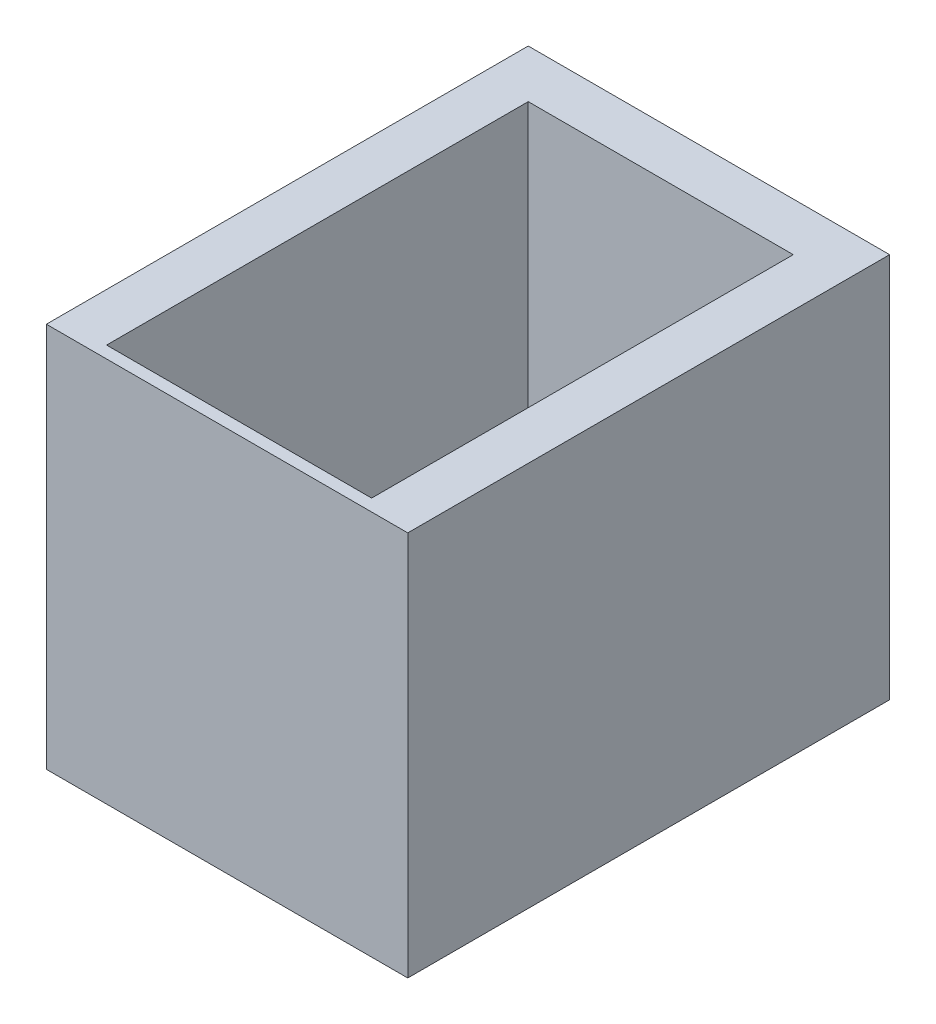
ISO-10303-21;
HEADER;
FILE_DESCRIPTION(('STEP AP214'),'2;1');
FILE_NAME('part.step','',(''),(''),'','','');
FILE_SCHEMA(('AUTOMOTIVE_DESIGN { 1 0 10303 214 1 1 1 1 }'));
ENDSEC;
DATA;
#1=APPLICATION_CONTEXT('core data for automotive mechanical design processes');
#2=APPLICATION_PROTOCOL_DEFINITION('international standard','automotive_design',2000,#1);
#3=PRODUCT_CONTEXT('',#1,'mechanical');
#4=PRODUCT('Part','Part','',(#3));
#5=PRODUCT_RELATED_PRODUCT_CATEGORY('part','',(#4));
#6=PRODUCT_DEFINITION_FORMATION('','',#4);
#7=PRODUCT_DEFINITION_CONTEXT('part definition',#1,'design');
#8=PRODUCT_DEFINITION('design','',#6,#7);
#9=PRODUCT_DEFINITION_SHAPE('','',#8);
#10=(LENGTH_UNIT() NAMED_UNIT(*) SI_UNIT(.MILLI.,.METRE.));
#11=(NAMED_UNIT(*) PLANE_ANGLE_UNIT() SI_UNIT($,.RADIAN.));
#12=(NAMED_UNIT(*) SI_UNIT($,.STERADIAN.) SOLID_ANGLE_UNIT());
#13=UNCERTAINTY_MEASURE_WITH_UNIT(LENGTH_MEASURE(1.E-05),#10,'distance_accuracy_value','');
#14=(GEOMETRIC_REPRESENTATION_CONTEXT(3) GLOBAL_UNCERTAINTY_ASSIGNED_CONTEXT((#13)) GLOBAL_UNIT_ASSIGNED_CONTEXT((#10,
#11,#12)) REPRESENTATION_CONTEXT('',''));
#15=CARTESIAN_POINT('',(0.,0.,0.));
#16=DIRECTION('',(0.,0.,1.));
#17=DIRECTION('',(1.,0.,0.));
#18=AXIS2_PLACEMENT_3D('',#15,#16,#17);
#19=CARTESIAN_POINT('',(0.,20.32,0.));
#20=DIRECTION('',(0.,-1.,0.));
#21=DIRECTION('',(0.,0.,-1.));
#22=AXIS2_PLACEMENT_3D('',#19,#20,#21);
#23=PLANE('',#22);
#24=DIRECTION('',(0.,0.,1.));
#25=VECTOR('',#24,1.);
#26=CARTESIAN_POINT('',(0.,20.32,0.));
#27=LINE('',#26,#25);
#28=CARTESIAN_POINT('',(0.,20.32,-25.4));
#29=VERTEX_POINT('',#28);
#30=CARTESIAN_POINT('',(0.,20.32,0.));
#31=VERTEX_POINT('',#30);
#32=EDGE_CURVE('E170',#29,#31,#27,.T.);
#33=ORIENTED_EDGE('',*,*,#32,.T.);
#34=DIRECTION('',(1.,0.,0.));
#35=VECTOR('',#34,1.);
#36=CARTESIAN_POINT('',(0.,20.32,0.));
#37=LINE('',#36,#35);
#38=CARTESIAN_POINT('',(19.05,20.32,0.));
#39=VERTEX_POINT('',#38);
#40=EDGE_CURVE('E174',#31,#39,#37,.T.);
#41=ORIENTED_EDGE('',*,*,#40,.T.);
#42=DIRECTION('',(0.,0.,-1.));
#43=VECTOR('',#42,1.);
#44=CARTESIAN_POINT('',(19.05,20.32,0.));
#45=LINE('',#44,#43);
#46=CARTESIAN_POINT('',(19.05,20.32,-25.4));
#47=VERTEX_POINT('',#46);
#48=EDGE_CURVE('E178',#39,#47,#45,.T.);
#49=ORIENTED_EDGE('',*,*,#48,.T.);
#50=DIRECTION('',(-1.,0.,0.));
#51=VECTOR('',#50,1.);
#52=CARTESIAN_POINT('',(0.,20.32,-25.4));
#53=LINE('',#52,#51);
#54=EDGE_CURVE('E181',#47,#29,#53,.T.);
#55=ORIENTED_EDGE('',*,*,#54,.T.);
#56=EDGE_LOOP('',(#33,#41,#49,#55));
#57=FACE_BOUND('',#56,.T.);
#58=DIRECTION('',(0.,0.,1.));
#59=VECTOR('',#58,1.);
#60=CARTESIAN_POINT('',(16.51,20.32,-22.86));
#61=LINE('',#60,#59);
#62=CARTESIAN_POINT('',(16.51,20.32,-22.86));
#63=VERTEX_POINT('',#62);
#64=CARTESIAN_POINT('',(16.51,20.32,-0.635));
#65=VERTEX_POINT('',#64);
#66=EDGE_CURVE('E111',#63,#65,#61,.T.);
#67=ORIENTED_EDGE('',*,*,#66,.T.);
#68=DIRECTION('',(-1.,0.,0.));
#69=VECTOR('',#68,1.);
#70=CARTESIAN_POINT('',(16.51,20.32,-0.635));
#71=LINE('',#70,#69);
#72=CARTESIAN_POINT('',(2.54,20.32,-0.635));
#73=VERTEX_POINT('',#72);
#74=EDGE_CURVE('E115',#65,#73,#71,.T.);
#75=ORIENTED_EDGE('',*,*,#74,.T.);
#76=DIRECTION('',(0.,0.,1.));
#77=VECTOR('',#76,1.);
#78=CARTESIAN_POINT('',(2.54,20.32,-22.86));
#79=LINE('',#78,#77);
#80=CARTESIAN_POINT('',(2.54,20.32,-22.86));
#81=VERTEX_POINT('',#80);
#82=EDGE_CURVE('E119',#81,#73,#79,.T.);
#83=ORIENTED_EDGE('',*,*,#82,.F.);
#84=DIRECTION('',(1.,0.,0.));
#85=VECTOR('',#84,1.);
#86=CARTESIAN_POINT('',(2.54,20.32,-22.86));
#87=LINE('',#86,#85);
#88=EDGE_CURVE('E63',#81,#63,#87,.T.);
#89=ORIENTED_EDGE('',*,*,#88,.T.);
#90=EDGE_LOOP('',(#67,#75,#83,#89));
#91=FACE_BOUND('',#90,.T.);
#92=ADVANCED_FACE('F39',(#57,#91),#23,.F.);
#93=CARTESIAN_POINT('',(0.,20.32,0.));
#94=DIRECTION('',(1.,0.,0.));
#95=DIRECTION('',(0.,0.,-1.));
#96=AXIS2_PLACEMENT_3D('',#93,#94,#95);
#97=PLANE('',#96);
#98=DIRECTION('',(0.,0.,1.));
#99=VECTOR('',#98,1.);
#100=CARTESIAN_POINT('',(0.,0.,0.));
#101=LINE('',#100,#99);
#102=CARTESIAN_POINT('',(0.,0.,-25.4));
#103=VERTEX_POINT('',#102);
#104=CARTESIAN_POINT('',(0.,0.,0.));
#105=VERTEX_POINT('',#104);
#106=EDGE_CURVE('E169',#103,#105,#101,.T.);
#107=ORIENTED_EDGE('',*,*,#106,.T.);
#108=DIRECTION('',(0.,-1.,0.));
#109=VECTOR('',#108,1.);
#110=CARTESIAN_POINT('',(0.,20.32,0.));
#111=LINE('',#110,#109);
#112=EDGE_CURVE('E11',#31,#105,#111,.T.);
#113=ORIENTED_EDGE('',*,*,#112,.F.);
#114=ORIENTED_EDGE('',*,*,#32,.F.);
#115=DIRECTION('',(0.,-1.,0.));
#116=VECTOR('',#115,1.);
#117=CARTESIAN_POINT('',(0.,20.32,-25.4));
#118=LINE('',#117,#116);
#119=EDGE_CURVE('E184',#29,#103,#118,.T.);
#120=ORIENTED_EDGE('',*,*,#119,.T.);
#121=EDGE_LOOP('',(#107,#113,#114,#120));
#122=FACE_BOUND('',#121,.T.);
#123=ADVANCED_FACE('F41',(#122),#97,.F.);
#124=CARTESIAN_POINT('',(0.,20.32,0.));
#125=DIRECTION('',(0.,0.,-1.));
#126=DIRECTION('',(-1.,0.,0.));
#127=AXIS2_PLACEMENT_3D('',#124,#125,#126);
#128=PLANE('',#127);
#129=DIRECTION('',(1.,0.,0.));
#130=VECTOR('',#129,1.);
#131=CARTESIAN_POINT('',(0.,0.,0.));
#132=LINE('',#131,#130);
#133=CARTESIAN_POINT('',(19.05,0.,0.));
#134=VERTEX_POINT('',#133);
#135=EDGE_CURVE('E188',#105,#134,#132,.T.);
#136=ORIENTED_EDGE('',*,*,#135,.T.);
#137=DIRECTION('',(0.,-1.,0.));
#138=VECTOR('',#137,1.);
#139=CARTESIAN_POINT('',(19.05,20.32,0.));
#140=LINE('',#139,#138);
#141=EDGE_CURVE('E48',#39,#134,#140,.T.);
#142=ORIENTED_EDGE('',*,*,#141,.F.);
#143=ORIENTED_EDGE('',*,*,#40,.F.);
#144=ORIENTED_EDGE('',*,*,#112,.T.);
#145=EDGE_LOOP('',(#136,#142,#143,#144));
#146=FACE_BOUND('',#145,.T.);
#147=ADVANCED_FACE('F223',(#146),#128,.F.);
#148=CARTESIAN_POINT('',(19.05,20.32,0.));
#149=DIRECTION('',(-1.,0.,0.));
#150=DIRECTION('',(0.,0.,1.));
#151=AXIS2_PLACEMENT_3D('',#148,#149,#150);
#152=PLANE('',#151);
#153=DIRECTION('',(0.,0.,-1.));
#154=VECTOR('',#153,1.);
#155=CARTESIAN_POINT('',(19.05,0.,0.));
#156=LINE('',#155,#154);
#157=CARTESIAN_POINT('',(19.05,0.,-25.4));
#158=VERTEX_POINT('',#157);
#159=EDGE_CURVE('E191',#134,#158,#156,.T.);
#160=ORIENTED_EDGE('',*,*,#159,.T.);
#161=DIRECTION('',(0.,-1.,0.));
#162=VECTOR('',#161,1.);
#163=CARTESIAN_POINT('',(19.05,20.32,-25.4));
#164=LINE('',#163,#162);
#165=EDGE_CURVE('E199',#47,#158,#164,.T.);
#166=ORIENTED_EDGE('',*,*,#165,.F.);
#167=ORIENTED_EDGE('',*,*,#48,.F.);
#168=ORIENTED_EDGE('',*,*,#141,.T.);
#169=EDGE_LOOP('',(#160,#166,#167,#168));
#170=FACE_BOUND('',#169,.T.);
#171=ADVANCED_FACE('F208',(#170),#152,.F.);
#172=CARTESIAN_POINT('',(0.,20.32,-25.4));
#173=DIRECTION('',(0.,0.,1.));
#174=DIRECTION('',(1.,0.,0.));
#175=AXIS2_PLACEMENT_3D('',#172,#173,#174);
#176=PLANE('',#175);
#177=DIRECTION('',(-1.,0.,0.));
#178=VECTOR('',#177,1.);
#179=CARTESIAN_POINT('',(0.,0.,-25.4));
#180=LINE('',#179,#178);
#181=EDGE_CURVE('E175',#158,#103,#180,.T.);
#182=ORIENTED_EDGE('',*,*,#181,.T.);
#183=ORIENTED_EDGE('',*,*,#119,.F.);
#184=ORIENTED_EDGE('',*,*,#54,.F.);
#185=ORIENTED_EDGE('',*,*,#165,.T.);
#186=EDGE_LOOP('',(#182,#183,#184,#185));
#187=FACE_BOUND('',#186,.T.);
#188=ADVANCED_FACE('F217',(#187),#176,.F.);
#189=CARTESIAN_POINT('',(0.,0.,0.));
#190=DIRECTION('',(0.,-1.,0.));
#191=DIRECTION('',(0.,0.,-1.));
#192=AXIS2_PLACEMENT_3D('',#189,#190,#191);
#193=PLANE('',#192);
#194=ORIENTED_EDGE('',*,*,#106,.F.);
#195=ORIENTED_EDGE('',*,*,#181,.F.);
#196=ORIENTED_EDGE('',*,*,#159,.F.);
#197=ORIENTED_EDGE('',*,*,#135,.F.);
#198=EDGE_LOOP('',(#194,#195,#196,#197));
#199=FACE_BOUND('',#198,.T.);
#200=ADVANCED_FACE('F214',(#199),#193,.T.);
#201=CARTESIAN_POINT('',(2.54,2.54,-22.86));
#202=DIRECTION('',(0.,0.,1.));
#203=DIRECTION('',(1.,0.,0.));
#204=AXIS2_PLACEMENT_3D('',#201,#202,#203);
#205=PLANE('',#204);
#206=ORIENTED_EDGE('',*,*,#88,.F.);
#207=DIRECTION('',(0.,1.,0.));
#208=VECTOR('',#207,1.);
#209=CARTESIAN_POINT('',(2.54,2.54,-22.86));
#210=LINE('',#209,#208);
#211=CARTESIAN_POINT('',(2.54,2.54,-22.86));
#212=VERTEX_POINT('',#211);
#213=EDGE_CURVE('E153',#212,#81,#210,.T.);
#214=ORIENTED_EDGE('',*,*,#213,.F.);
#215=DIRECTION('',(1.,0.,0.));
#216=VECTOR('',#215,1.);
#217=CARTESIAN_POINT('',(2.54,2.54,-22.86));
#218=LINE('',#217,#216);
#219=CARTESIAN_POINT('',(16.51,2.54,-22.86));
#220=VERTEX_POINT('',#219);
#221=EDGE_CURVE('E138',#212,#220,#218,.T.);
#222=ORIENTED_EDGE('',*,*,#221,.T.);
#223=DIRECTION('',(0.,1.,0.));
#224=VECTOR('',#223,1.);
#225=CARTESIAN_POINT('',(16.51,2.54,-22.86));
#226=LINE('',#225,#224);
#227=EDGE_CURVE('E166',#220,#63,#226,.T.);
#228=ORIENTED_EDGE('',*,*,#227,.T.);
#229=EDGE_LOOP('',(#206,#214,#222,#228));
#230=FACE_BOUND('',#229,.T.);
#231=ADVANCED_FACE('F236',(#230),#205,.T.);
#232=CARTESIAN_POINT('',(16.51,2.54,-22.86));
#233=DIRECTION('',(-1.,0.,0.));
#234=DIRECTION('',(0.,0.,1.));
#235=AXIS2_PLACEMENT_3D('',#232,#233,#234);
#236=PLANE('',#235);
#237=DIRECTION('',(0.,0.969620700641351,0.244613362038496));
#238=VECTOR('',#237,1.);
#239=CARTESIAN_POINT('',(16.51,12.6789760286569,-2.56265744564928));
#240=LINE('',#239,#238);
#241=CARTESIAN_POINT('',(16.51,12.7687876732136,-2.54));
#242=VERTEX_POINT('',#241);
#243=EDGE_CURVE('E122',#242,#65,#240,.T.);
#244=ORIENTED_EDGE('',*,*,#243,.T.);
#245=ORIENTED_EDGE('',*,*,#66,.F.);
#246=ORIENTED_EDGE('',*,*,#227,.F.);
#247=DIRECTION('',(0.,0.,1.));
#248=VECTOR('',#247,1.);
#249=CARTESIAN_POINT('',(16.51,2.54,-22.86));
#250=LINE('',#249,#248);
#251=CARTESIAN_POINT('',(16.51,2.54,-2.54));
#252=VERTEX_POINT('',#251);
#253=EDGE_CURVE('E142',#220,#252,#250,.T.);
#254=ORIENTED_EDGE('',*,*,#253,.T.);
#255=DIRECTION('',(0.,1.,0.));
#256=VECTOR('',#255,1.);
#257=CARTESIAN_POINT('',(16.51,2.54,-2.54));
#258=LINE('',#257,#256);
#259=EDGE_CURVE('E125',#252,#242,#258,.T.);
#260=ORIENTED_EDGE('',*,*,#259,.T.);
#261=EDGE_LOOP('',(#244,#245,#246,#254,#260));
#262=FACE_BOUND('',#261,.T.);
#263=ADVANCED_FACE('F123',(#262),#236,.T.);
#264=CARTESIAN_POINT('',(2.54,2.54,-2.54));
#265=DIRECTION('',(0.,0.,1.));
#266=DIRECTION('',(1.,0.,0.));
#267=AXIS2_PLACEMENT_3D('',#264,#265,#266);
#268=PLANE('',#267);
#269=DIRECTION('',(0.,1.,0.));
#270=VECTOR('',#269,1.);
#271=CARTESIAN_POINT('',(2.54,2.54,-2.54));
#272=LINE('',#271,#270);
#273=CARTESIAN_POINT('',(2.54,2.54,-2.54));
#274=VERTEX_POINT('',#273);
#275=CARTESIAN_POINT('',(2.54,12.7687876732136,-2.54));
#276=VERTEX_POINT('',#275);
#277=EDGE_CURVE('E160',#274,#276,#272,.T.);
#278=ORIENTED_EDGE('',*,*,#277,.T.);
#279=DIRECTION('',(1.,0.,0.));
#280=VECTOR('',#279,1.);
#281=CARTESIAN_POINT('',(2.54,12.7687876732135,-2.54));
#282=LINE('',#281,#280);
#283=EDGE_CURVE('E132',#276,#242,#282,.T.);
#284=ORIENTED_EDGE('',*,*,#283,.T.);
#285=ORIENTED_EDGE('',*,*,#259,.F.);
#286=DIRECTION('',(1.,0.,0.));
#287=VECTOR('',#286,1.);
#288=CARTESIAN_POINT('',(2.54,2.54,-2.54));
#289=LINE('',#288,#287);
#290=EDGE_CURVE('E145',#274,#252,#289,.T.);
#291=ORIENTED_EDGE('',*,*,#290,.F.);
#292=EDGE_LOOP('',(#278,#284,#285,#291));
#293=FACE_BOUND('',#292,.T.);
#294=ADVANCED_FACE('F261',(#293),#268,.F.);
#295=CARTESIAN_POINT('',(2.54,2.54,-22.86));
#296=DIRECTION('',(-1.,0.,0.));
#297=DIRECTION('',(0.,0.,1.));
#298=AXIS2_PLACEMENT_3D('',#295,#296,#297);
#299=PLANE('',#298);
#300=ORIENTED_EDGE('',*,*,#82,.T.);
#301=DIRECTION('',(0.,0.969620700641351,0.244613362038496));
#302=VECTOR('',#301,1.);
#303=CARTESIAN_POINT('',(2.54,12.6789760286569,-2.56265744564928));
#304=LINE('',#303,#302);
#305=EDGE_CURVE('E55',#276,#73,#304,.T.);
#306=ORIENTED_EDGE('',*,*,#305,.F.);
#307=ORIENTED_EDGE('',*,*,#277,.F.);
#308=DIRECTION('',(0.,0.,1.));
#309=VECTOR('',#308,1.);
#310=CARTESIAN_POINT('',(2.54,2.54,-22.86));
#311=LINE('',#310,#309);
#312=EDGE_CURVE('E149',#212,#274,#311,.T.);
#313=ORIENTED_EDGE('',*,*,#312,.F.);
#314=ORIENTED_EDGE('',*,*,#213,.T.);
#315=EDGE_LOOP('',(#300,#306,#307,#313,#314));
#316=FACE_BOUND('',#315,.T.);
#317=ADVANCED_FACE('F267',(#316),#299,.F.);
#318=CARTESIAN_POINT('',(0.,2.54,0.));
#319=DIRECTION('',(0.,-1.,0.));
#320=DIRECTION('',(0.,0.,-1.));
#321=AXIS2_PLACEMENT_3D('',#318,#319,#320);
#322=PLANE('',#321);
#323=ORIENTED_EDGE('',*,*,#221,.F.);
#324=ORIENTED_EDGE('',*,*,#312,.T.);
#325=ORIENTED_EDGE('',*,*,#290,.T.);
#326=ORIENTED_EDGE('',*,*,#253,.F.);
#327=EDGE_LOOP('',(#323,#324,#325,#326));
#328=FACE_BOUND('',#327,.T.);
#329=ADVANCED_FACE('F275',(#328),#322,.F.);
#330=CARTESIAN_POINT('',(16.51,12.6789760286569,-2.56265744564928));
#331=DIRECTION('',(0.,-0.244613362038496,0.969620700641351));
#332=DIRECTION('',(0.,-0.969620700641351,-0.244613362038496));
#333=AXIS2_PLACEMENT_3D('',#330,#331,#332);
#334=PLANE('',#333);
#335=ORIENTED_EDGE('',*,*,#305,.T.);
#336=ORIENTED_EDGE('',*,*,#74,.F.);
#337=ORIENTED_EDGE('',*,*,#243,.F.);
#338=ORIENTED_EDGE('',*,*,#283,.F.);
#339=EDGE_LOOP('',(#335,#336,#337,#338));
#340=FACE_BOUND('',#339,.T.);
#341=ADVANCED_FACE('F130',(#340),#334,.F.);
#342=CLOSED_SHELL('',(#92,#123,#147,#171,#188,#200,#231,#263,#294,#317,#329,#341));
#343=MANIFOLD_SOLID_BREP('B2',#342);
#344=ADVANCED_BREP_SHAPE_REPRESENTATION('',(#18,#343),#14);
#345=SHAPE_DEFINITION_REPRESENTATION(#9,#344);
ENDSEC;
END-ISO-10303-21;
